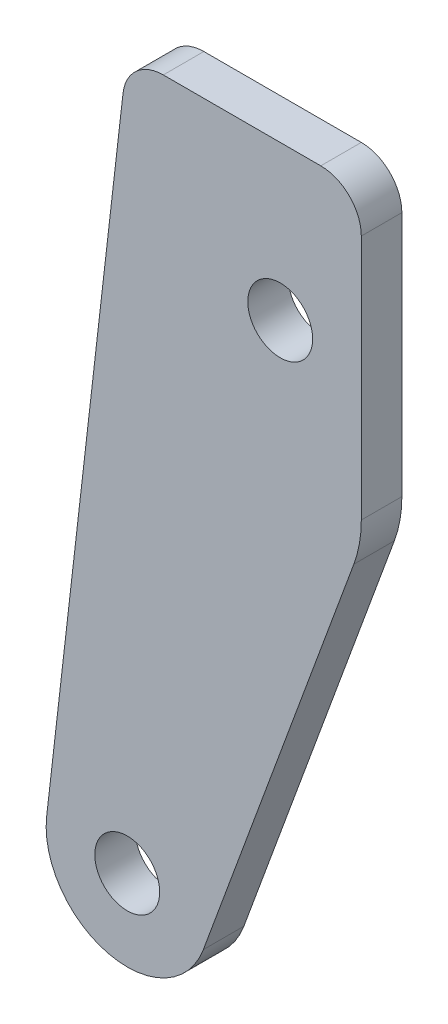
ISO-10303-21;
HEADER;
FILE_DESCRIPTION(('STEP AP214'),'2;1');
FILE_NAME('part.step','',(''),(''),'','','');
FILE_SCHEMA(('AUTOMOTIVE_DESIGN { 1 0 10303 214 1 1 1 1 }'));
ENDSEC;
DATA;
#1=APPLICATION_CONTEXT('core data for automotive mechanical design processes');
#2=APPLICATION_PROTOCOL_DEFINITION('international standard','automotive_design',2000,#1);
#3=PRODUCT_CONTEXT('',#1,'mechanical');
#4=PRODUCT('Part','Part','',(#3));
#5=PRODUCT_RELATED_PRODUCT_CATEGORY('part','',(#4));
#6=PRODUCT_DEFINITION_FORMATION('','',#4);
#7=PRODUCT_DEFINITION_CONTEXT('part definition',#1,'design');
#8=PRODUCT_DEFINITION('design','',#6,#7);
#9=PRODUCT_DEFINITION_SHAPE('','',#8);
#10=(LENGTH_UNIT() NAMED_UNIT(*) SI_UNIT(.MILLI.,.METRE.));
#11=(NAMED_UNIT(*) PLANE_ANGLE_UNIT() SI_UNIT($,.RADIAN.));
#12=(NAMED_UNIT(*) SI_UNIT($,.STERADIAN.) SOLID_ANGLE_UNIT());
#13=UNCERTAINTY_MEASURE_WITH_UNIT(LENGTH_MEASURE(1.E-05),#10,'distance_accuracy_value','');
#14=(GEOMETRIC_REPRESENTATION_CONTEXT(3) GLOBAL_UNCERTAINTY_ASSIGNED_CONTEXT((#13)) GLOBAL_UNIT_ASSIGNED_CONTEXT((#10,
#11,#12)) REPRESENTATION_CONTEXT('',''));
#15=CARTESIAN_POINT('',(0.,0.,0.));
#16=DIRECTION('',(0.,0.,1.));
#17=DIRECTION('',(1.,0.,0.));
#18=AXIS2_PLACEMENT_3D('',#15,#16,#17);
#19=CARTESIAN_POINT('',(18.7698363949979,-6.90602937330929,-10.));
#20=DIRECTION('',(-0.938491819749897,0.345301468665465,0.));
#21=DIRECTION('',(-0.345301468665465,-0.938491819749897,0.));
#22=AXIS2_PLACEMENT_3D('',#19,#20,#21);
#23=PLANE('',#22);
#24=DIRECTION('',(-0.345301468665465,-0.938491819749897,0.));
#25=VECTOR('',#24,1.);
#26=CARTESIAN_POINT('',(18.7698363949979,-6.90602937330929,0.));
#27=LINE('',#26,#25);
#28=CARTESIAN_POINT('',(55.8908416393941,93.9848237626511,0.));
#29=VERTEX_POINT('',#28);
#30=CARTESIAN_POINT('',(18.7698363949979,-6.9060293733093,0.));
#31=VERTEX_POINT('',#30);
#32=EDGE_CURVE('E139',#29,#31,#27,.T.);
#33=ORIENTED_EDGE('',*,*,#32,.T.);
#34=DIRECTION('',(0.,0.,1.));
#35=VECTOR('',#34,1.);
#36=CARTESIAN_POINT('',(18.7698363949979,-6.9060293733093,-10.));
#37=LINE('',#36,#35);
#38=CARTESIAN_POINT('',(18.7698363949979,-6.9060293733093,-10.));
#39=VERTEX_POINT('',#38);
#40=EDGE_CURVE('E11',#39,#31,#37,.T.);
#41=ORIENTED_EDGE('',*,*,#40,.F.);
#42=DIRECTION('',(-0.345301468665465,-0.938491819749897,0.));
#43=VECTOR('',#42,1.);
#44=CARTESIAN_POINT('',(18.7698363949979,-6.90602937330929,-10.));
#45=LINE('',#44,#43);
#46=CARTESIAN_POINT('',(55.8908416393941,93.9848237626511,-10.));
#47=VERTEX_POINT('',#46);
#48=EDGE_CURVE('E53',#47,#39,#45,.T.);
#49=ORIENTED_EDGE('',*,*,#48,.F.);
#50=DIRECTION('',(0.,0.,1.));
#51=VECTOR('',#50,1.);
#52=CARTESIAN_POINT('',(55.8908416393941,93.9848237626511,-10.));
#53=LINE('',#52,#51);
#54=EDGE_CURVE('E38',#47,#29,#53,.T.);
#55=ORIENTED_EDGE('',*,*,#54,.T.);
#56=EDGE_LOOP('',(#33,#41,#49,#55));
#57=FACE_BOUND('',#56,.T.);
#58=ADVANCED_FACE('F35',(#57),#23,.F.);
#59=CARTESIAN_POINT('',(0.,0.,-10.));
#60=DIRECTION('',(0.,0.,1.));
#61=DIRECTION('',(1.,0.,0.));
#62=AXIS2_PLACEMENT_3D('',#59,#60,#61);
#63=CYLINDRICAL_SURFACE('',#62,20.);
#64=CARTESIAN_POINT('',(0.,0.,0.));
#65=DIRECTION('',(0.,0.,1.));
#66=DIRECTION('',(1.,0.,0.));
#67=AXIS2_PLACEMENT_3D('',#64,#65,#66);
#68=CIRCLE('',#67,20.);
#69=CARTESIAN_POINT('',(-19.8691922002051,2.28368152580614,0.));
#70=VERTEX_POINT('',#69);
#71=EDGE_CURVE('E156',#70,#31,#68,.T.);
#72=ORIENTED_EDGE('',*,*,#71,.F.);
#73=DIRECTION('',(0.,0.,1.));
#74=VECTOR('',#73,1.);
#75=CARTESIAN_POINT('',(-19.8691922002051,2.28368152580614,-10.));
#76=LINE('',#75,#74);
#77=CARTESIAN_POINT('',(-19.8691922002051,2.28368152580614,-10.));
#78=VERTEX_POINT('',#77);
#79=EDGE_CURVE('E44',#78,#70,#76,.T.);
#80=ORIENTED_EDGE('',*,*,#79,.F.);
#81=CARTESIAN_POINT('',(0.,0.,-10.));
#82=DIRECTION('',(0.,0.,1.));
#83=DIRECTION('',(1.,0.,0.));
#84=AXIS2_PLACEMENT_3D('',#81,#82,#83);
#85=CIRCLE('',#84,20.);
#86=EDGE_CURVE('E123',#78,#39,#85,.T.);
#87=ORIENTED_EDGE('',*,*,#86,.T.);
#88=ORIENTED_EDGE('',*,*,#40,.T.);
#89=EDGE_LOOP('',(#72,#80,#87,#88));
#90=FACE_BOUND('',#89,.T.);
#91=ADVANCED_FACE('F193',(#90),#63,.T.);
#92=CARTESIAN_POINT('',(-19.8691922002051,2.28368152580614,-10.));
#93=DIRECTION('',(-0.993459610010256,0.114184076290307,0.));
#94=DIRECTION('',(-0.114184076290307,-0.993459610010256,0.));
#95=AXIS2_PLACEMENT_3D('',#92,#93,#94);
#96=PLANE('',#95);
#97=DIRECTION('',(-0.114184076290307,-0.993459610010256,0.));
#98=VECTOR('',#97,1.);
#99=CARTESIAN_POINT('',(-19.8691922002051,2.28368152580614,0.));
#100=LINE('',#99,#98);
#101=CARTESIAN_POINT('',(-1.03602337623573,166.141840762903,0.));
#102=VERTEX_POINT('',#101);
#103=EDGE_CURVE('E110',#102,#70,#100,.T.);
#104=ORIENTED_EDGE('',*,*,#103,.F.);
#105=DIRECTION('',(0.,0.,1.));
#106=VECTOR('',#105,1.);
#107=CARTESIAN_POINT('',(-1.03602337623573,166.141840762903,-10.));
#108=LINE('',#107,#106);
#109=CARTESIAN_POINT('',(-1.03602337623573,166.141840762903,-10.));
#110=VERTEX_POINT('',#109);
#111=EDGE_CURVE('E106',#110,#102,#108,.T.);
#112=ORIENTED_EDGE('',*,*,#111,.F.);
#113=DIRECTION('',(-0.114184076290307,-0.993459610010256,0.));
#114=VECTOR('',#113,1.);
#115=CARTESIAN_POINT('',(-19.8691922002051,2.28368152580614,-10.));
#116=LINE('',#115,#114);
#117=EDGE_CURVE('E109',#110,#78,#116,.T.);
#118=ORIENTED_EDGE('',*,*,#117,.T.);
#119=ORIENTED_EDGE('',*,*,#79,.T.);
#120=EDGE_LOOP('',(#104,#112,#118,#119));
#121=FACE_BOUND('',#120,.T.);
#122=ADVANCED_FACE('F108',(#121),#96,.T.);
#123=CARTESIAN_POINT('',(8.89857272386683,165.,-10.));
#124=DIRECTION('',(0.,0.,1.));
#125=DIRECTION('',(1.,0.,0.));
#126=AXIS2_PLACEMENT_3D('',#123,#124,#125);
#127=CYLINDRICAL_SURFACE('',#126,10.);
#128=CARTESIAN_POINT('',(8.89857272386683,165.,0.));
#129=DIRECTION('',(0.,0.,1.));
#130=DIRECTION('',(1.,0.,0.));
#131=AXIS2_PLACEMENT_3D('',#128,#129,#130);
#132=CIRCLE('',#131,10.);
#133=CARTESIAN_POINT('',(8.89857272386689,175.,0.));
#134=VERTEX_POINT('',#133);
#135=EDGE_CURVE('E153',#134,#102,#132,.T.);
#136=ORIENTED_EDGE('',*,*,#135,.F.);
#137=DIRECTION('',(0.,0.,1.));
#138=VECTOR('',#137,1.);
#139=CARTESIAN_POINT('',(8.89857272386689,175.,-10.));
#140=LINE('',#139,#138);
#141=CARTESIAN_POINT('',(8.89857272386689,175.,-10.));
#142=VERTEX_POINT('',#141);
#143=EDGE_CURVE('E115',#142,#134,#140,.T.);
#144=ORIENTED_EDGE('',*,*,#143,.F.);
#145=CARTESIAN_POINT('',(8.89857272386683,165.,-10.));
#146=DIRECTION('',(0.,0.,1.));
#147=DIRECTION('',(1.,0.,0.));
#148=AXIS2_PLACEMENT_3D('',#145,#146,#147);
#149=CIRCLE('',#148,10.);
#150=EDGE_CURVE('E121',#142,#110,#149,.T.);
#151=ORIENTED_EDGE('',*,*,#150,.T.);
#152=ORIENTED_EDGE('',*,*,#111,.T.);
#153=EDGE_LOOP('',(#136,#144,#151,#152));
#154=FACE_BOUND('',#153,.T.);
#155=ADVANCED_FACE('F125',(#154),#127,.T.);
#156=CARTESIAN_POINT('',(0.,175.,-10.));
#157=DIRECTION('',(0.,1.,0.));
#158=DIRECTION('',(0.,0.,1.));
#159=AXIS2_PLACEMENT_3D('',#156,#157,#158);
#160=PLANE('',#159);
#161=DIRECTION('',(-1.,0.,0.));
#162=VECTOR('',#161,1.);
#163=CARTESIAN_POINT('',(0.,175.,0.));
#164=LINE('',#163,#162);
#165=CARTESIAN_POINT('',(47.7360870468972,175.,0.));
#166=VERTEX_POINT('',#165);
#167=EDGE_CURVE('E150',#166,#134,#164,.T.);
#168=ORIENTED_EDGE('',*,*,#167,.F.);
#169=DIRECTION('',(0.,0.,1.));
#170=VECTOR('',#169,1.);
#171=CARTESIAN_POINT('',(47.7360870468972,175.,-10.));
#172=LINE('',#171,#170);
#173=CARTESIAN_POINT('',(47.7360870468972,175.,-10.));
#174=VERTEX_POINT('',#173);
#175=EDGE_CURVE('E167',#174,#166,#172,.T.);
#176=ORIENTED_EDGE('',*,*,#175,.F.);
#177=DIRECTION('',(-1.,0.,0.));
#178=VECTOR('',#177,1.);
#179=CARTESIAN_POINT('',(0.,175.,-10.));
#180=LINE('',#179,#178);
#181=EDGE_CURVE('E126',#174,#142,#180,.T.);
#182=ORIENTED_EDGE('',*,*,#181,.T.);
#183=ORIENTED_EDGE('',*,*,#143,.T.);
#184=EDGE_LOOP('',(#168,#176,#182,#183));
#185=FACE_BOUND('',#184,.T.);
#186=ADVANCED_FACE('F205',(#185),#160,.T.);
#187=CARTESIAN_POINT('',(47.7360870468972,165.,-10.));
#188=DIRECTION('',(0.,0.,1.));
#189=DIRECTION('',(1.,0.,0.));
#190=AXIS2_PLACEMENT_3D('',#187,#188,#189);
#191=CYLINDRICAL_SURFACE('',#190,10.);
#192=CARTESIAN_POINT('',(47.7360870468972,165.,0.));
#193=DIRECTION('',(0.,0.,1.));
#194=DIRECTION('',(1.,0.,0.));
#195=AXIS2_PLACEMENT_3D('',#192,#193,#194);
#196=CIRCLE('',#195,10.);
#197=CARTESIAN_POINT('',(57.7360870468972,165.,0.));
#198=VERTEX_POINT('',#197);
#199=EDGE_CURVE('E147',#198,#166,#196,.T.);
#200=ORIENTED_EDGE('',*,*,#199,.F.);
#201=DIRECTION('',(0.,0.,1.));
#202=VECTOR('',#201,1.);
#203=CARTESIAN_POINT('',(57.7360870468972,165.,-10.));
#204=LINE('',#203,#202);
#205=CARTESIAN_POINT('',(57.7360870468972,165.,-10.));
#206=VERTEX_POINT('',#205);
#207=EDGE_CURVE('E169',#206,#198,#204,.T.);
#208=ORIENTED_EDGE('',*,*,#207,.F.);
#209=CARTESIAN_POINT('',(47.7360870468972,165.,-10.));
#210=DIRECTION('',(0.,0.,1.));
#211=DIRECTION('',(1.,0.,0.));
#212=AXIS2_PLACEMENT_3D('',#209,#210,#211);
#213=CIRCLE('',#212,10.);
#214=EDGE_CURVE('E128',#206,#174,#213,.T.);
#215=ORIENTED_EDGE('',*,*,#214,.T.);
#216=ORIENTED_EDGE('',*,*,#175,.T.);
#217=EDGE_LOOP('',(#200,#208,#215,#216));
#218=FACE_BOUND('',#217,.T.);
#219=ADVANCED_FACE('F208',(#218),#191,.T.);
#220=CARTESIAN_POINT('',(57.7360870468972,0.,-10.));
#221=DIRECTION('',(-1.,0.,0.));
#222=DIRECTION('',(0.,-1.,0.));
#223=AXIS2_PLACEMENT_3D('',#220,#221,#222);
#224=PLANE('',#223);
#225=DIRECTION('',(0.,-1.,0.));
#226=VECTOR('',#225,1.);
#227=CARTESIAN_POINT('',(57.7360870468972,0.,0.));
#228=LINE('',#227,#226);
#229=CARTESIAN_POINT('',(57.7360870468972,104.343867822615,0.));
#230=VERTEX_POINT('',#229);
#231=EDGE_CURVE('E144',#198,#230,#228,.T.);
#232=ORIENTED_EDGE('',*,*,#231,.T.);
#233=DIRECTION('',(0.,0.,1.));
#234=VECTOR('',#233,1.);
#235=CARTESIAN_POINT('',(57.7360870468972,104.343867822615,-10.));
#236=LINE('',#235,#234);
#237=CARTESIAN_POINT('',(57.7360870468972,104.343867822615,-10.));
#238=VERTEX_POINT('',#237);
#239=EDGE_CURVE('E170',#238,#230,#236,.T.);
#240=ORIENTED_EDGE('',*,*,#239,.F.);
#241=DIRECTION('',(0.,-1.,0.));
#242=VECTOR('',#241,1.);
#243=CARTESIAN_POINT('',(57.7360870468972,0.,-10.));
#244=LINE('',#243,#242);
#245=EDGE_CURVE('E221',#206,#238,#244,.T.);
#246=ORIENTED_EDGE('',*,*,#245,.F.);
#247=ORIENTED_EDGE('',*,*,#207,.T.);
#248=EDGE_LOOP('',(#232,#240,#246,#247));
#249=FACE_BOUND('',#248,.T.);
#250=ADVANCED_FACE('F188',(#249),#224,.F.);
#251=CARTESIAN_POINT('',(0.,0.,-10.));
#252=DIRECTION('',(0.,0.,1.));
#253=DIRECTION('',(1.,0.,0.));
#254=AXIS2_PLACEMENT_3D('',#251,#252,#253);
#255=CYLINDRICAL_SURFACE('',#254,8.);
#256=CARTESIAN_POINT('',(0.,0.,-10.));
#257=DIRECTION('',(0.,0.,1.));
#258=DIRECTION('',(1.,0.,0.));
#259=AXIS2_PLACEMENT_3D('',#256,#257,#258);
#260=CIRCLE('',#259,8.);
#261=CARTESIAN_POINT('',(8.,0.,-10.));
#262=VERTEX_POINT('',#261);
#263=EDGE_CURVE('E133',#262,#262,#260,.T.);
#264=ORIENTED_EDGE('',*,*,#263,.F.);
#265=EDGE_LOOP('',(#264));
#266=FACE_BOUND('',#265,.T.);
#267=CARTESIAN_POINT('',(0.,0.,0.));
#268=DIRECTION('',(0.,0.,1.));
#269=DIRECTION('',(1.,0.,0.));
#270=AXIS2_PLACEMENT_3D('',#267,#268,#269);
#271=CIRCLE('',#270,8.);
#272=CARTESIAN_POINT('',(8.,0.,0.));
#273=VERTEX_POINT('',#272);
#274=EDGE_CURVE('E159',#273,#273,#271,.T.);
#275=ORIENTED_EDGE('',*,*,#274,.T.);
#276=EDGE_LOOP('',(#275));
#277=FACE_BOUND('',#276,.T.);
#278=ADVANCED_FACE('F181',(#266,#277),#255,.F.);
#279=CARTESIAN_POINT('',(27.7360870468972,104.343867822615,-10.));
#280=DIRECTION('',(0.,0.,1.));
#281=DIRECTION('',(1.,0.,0.));
#282=AXIS2_PLACEMENT_3D('',#279,#280,#281);
#283=CYLINDRICAL_SURFACE('',#282,30.);
#284=CARTESIAN_POINT('',(27.7360870468972,104.343867822615,0.));
#285=DIRECTION('',(0.,0.,1.));
#286=DIRECTION('',(1.,0.,0.));
#287=AXIS2_PLACEMENT_3D('',#284,#285,#286);
#288=CIRCLE('',#287,30.);
#289=EDGE_CURVE('E141',#29,#230,#288,.T.);
#290=ORIENTED_EDGE('',*,*,#289,.F.);
#291=ORIENTED_EDGE('',*,*,#54,.F.);
#292=CARTESIAN_POINT('',(27.7360870468972,104.343867822615,-10.));
#293=DIRECTION('',(0.,0.,1.));
#294=DIRECTION('',(1.,0.,0.));
#295=AXIS2_PLACEMENT_3D('',#292,#293,#294);
#296=CIRCLE('',#295,30.);
#297=EDGE_CURVE('E222',#47,#238,#296,.T.);
#298=ORIENTED_EDGE('',*,*,#297,.T.);
#299=ORIENTED_EDGE('',*,*,#239,.T.);
#300=EDGE_LOOP('',(#290,#291,#298,#299));
#301=FACE_BOUND('',#300,.T.);
#302=ADVANCED_FACE('F178',(#301),#283,.T.);
#303=CARTESIAN_POINT('',(37.7360870468972,137.,-10.));
#304=DIRECTION('',(0.,0.,1.));
#305=DIRECTION('',(1.,0.,0.));
#306=AXIS2_PLACEMENT_3D('',#303,#304,#305);
#307=CYLINDRICAL_SURFACE('',#306,8.);
#308=CARTESIAN_POINT('',(37.7360870468972,137.,-10.));
#309=DIRECTION('',(0.,0.,1.));
#310=DIRECTION('',(1.,0.,0.));
#311=AXIS2_PLACEMENT_3D('',#308,#309,#310);
#312=CIRCLE('',#311,8.);
#313=CARTESIAN_POINT('',(45.7360870468972,137.,-10.));
#314=VERTEX_POINT('',#313);
#315=EDGE_CURVE('E136',#314,#314,#312,.T.);
#316=ORIENTED_EDGE('',*,*,#315,.F.);
#317=EDGE_LOOP('',(#316));
#318=FACE_BOUND('',#317,.T.);
#319=CARTESIAN_POINT('',(37.7360870468972,137.,0.));
#320=DIRECTION('',(0.,0.,1.));
#321=DIRECTION('',(1.,0.,0.));
#322=AXIS2_PLACEMENT_3D('',#319,#320,#321);
#323=CIRCLE('',#322,8.);
#324=CARTESIAN_POINT('',(45.7360870468972,137.,0.));
#325=VERTEX_POINT('',#324);
#326=EDGE_CURVE('E162',#325,#325,#323,.T.);
#327=ORIENTED_EDGE('',*,*,#326,.T.);
#328=EDGE_LOOP('',(#327));
#329=FACE_BOUND('',#328,.T.);
#330=ADVANCED_FACE('F180',(#318,#329),#307,.F.);
#331=CARTESIAN_POINT('',(0.,0.,-10.));
#332=DIRECTION('',(0.,0.,1.));
#333=DIRECTION('',(1.,0.,0.));
#334=AXIS2_PLACEMENT_3D('',#331,#332,#333);
#335=PLANE('',#334);
#336=ORIENTED_EDGE('',*,*,#48,.T.);
#337=ORIENTED_EDGE('',*,*,#86,.F.);
#338=ORIENTED_EDGE('',*,*,#117,.F.);
#339=ORIENTED_EDGE('',*,*,#150,.F.);
#340=ORIENTED_EDGE('',*,*,#181,.F.);
#341=ORIENTED_EDGE('',*,*,#214,.F.);
#342=ORIENTED_EDGE('',*,*,#245,.T.);
#343=ORIENTED_EDGE('',*,*,#297,.F.);
#344=EDGE_LOOP('',(#336,#337,#338,#339,#340,#341,#342,#343));
#345=FACE_BOUND('',#344,.T.);
#346=ORIENTED_EDGE('',*,*,#263,.T.);
#347=EDGE_LOOP('',(#346));
#348=FACE_BOUND('',#347,.T.);
#349=ORIENTED_EDGE('',*,*,#315,.T.);
#350=EDGE_LOOP('',(#349));
#351=FACE_BOUND('',#350,.T.);
#352=ADVANCED_FACE('F118',(#345,#348,#351),#335,.F.);
#353=CARTESIAN_POINT('',(0.,0.,0.));
#354=DIRECTION('',(0.,0.,1.));
#355=DIRECTION('',(1.,0.,0.));
#356=AXIS2_PLACEMENT_3D('',#353,#354,#355);
#357=PLANE('',#356);
#358=ORIENTED_EDGE('',*,*,#32,.F.);
#359=ORIENTED_EDGE('',*,*,#289,.T.);
#360=ORIENTED_EDGE('',*,*,#231,.F.);
#361=ORIENTED_EDGE('',*,*,#199,.T.);
#362=ORIENTED_EDGE('',*,*,#167,.T.);
#363=ORIENTED_EDGE('',*,*,#135,.T.);
#364=ORIENTED_EDGE('',*,*,#103,.T.);
#365=ORIENTED_EDGE('',*,*,#71,.T.);
#366=EDGE_LOOP('',(#358,#359,#360,#361,#362,#363,#364,#365));
#367=FACE_BOUND('',#366,.T.);
#368=ORIENTED_EDGE('',*,*,#274,.F.);
#369=EDGE_LOOP('',(#368));
#370=FACE_BOUND('',#369,.T.);
#371=ORIENTED_EDGE('',*,*,#326,.F.);
#372=EDGE_LOOP('',(#371));
#373=FACE_BOUND('',#372,.T.);
#374=ADVANCED_FACE('F175',(#367,#370,#373),#357,.T.);
#375=CLOSED_SHELL('',(#58,#91,#122,#155,#186,#219,#250,#278,#302,#330,#352,#374));
#376=MANIFOLD_SOLID_BREP('B2',#375);
#377=ADVANCED_BREP_SHAPE_REPRESENTATION('',(#18,#376),#14);
#378=SHAPE_DEFINITION_REPRESENTATION(#9,#377);
ENDSEC;
END-ISO-10303-21;
